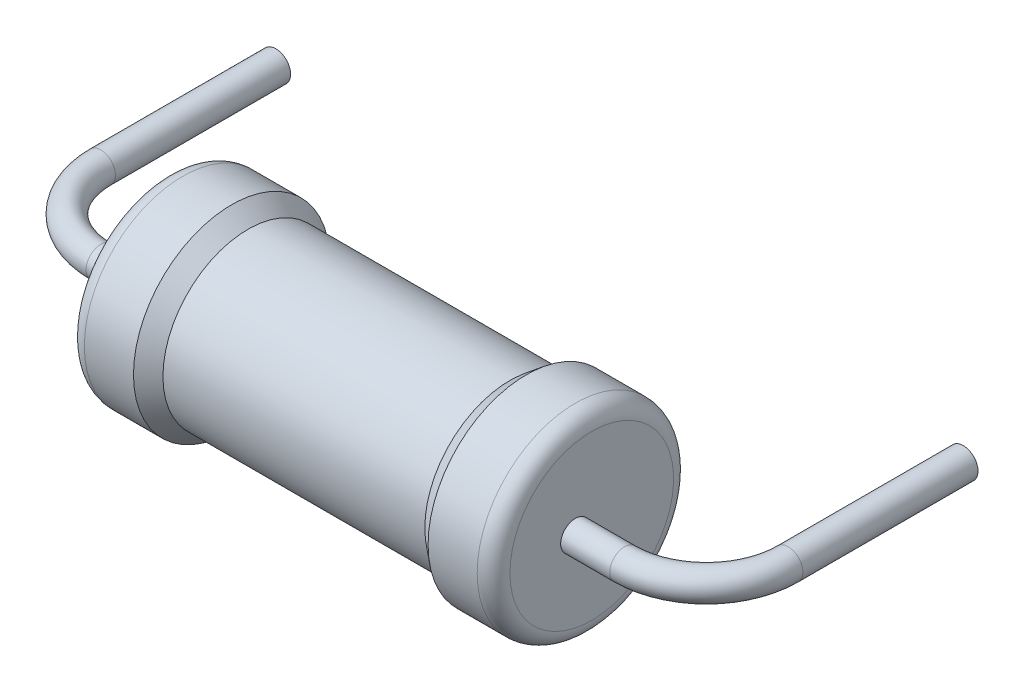
ISO-10303-21;
HEADER;
FILE_DESCRIPTION(('STEP AP214'),'2;1');
FILE_NAME('part.step','',(''),(''),'','','');
FILE_SCHEMA(('AUTOMOTIVE_DESIGN { 1 0 10303 214 1 1 1 1 }'));
ENDSEC;
DATA;
#1=APPLICATION_CONTEXT('core data for automotive mechanical design processes');
#2=APPLICATION_PROTOCOL_DEFINITION('international standard','automotive_design',2000,#1);
#3=PRODUCT_CONTEXT('',#1,'mechanical');
#4=PRODUCT('Part','Part','',(#3));
#5=PRODUCT_RELATED_PRODUCT_CATEGORY('part','',(#4));
#6=PRODUCT_DEFINITION_FORMATION('','',#4);
#7=PRODUCT_DEFINITION_CONTEXT('part definition',#1,'design');
#8=PRODUCT_DEFINITION('design','',#6,#7);
#9=PRODUCT_DEFINITION_SHAPE('','',#8);
#10=(LENGTH_UNIT() NAMED_UNIT(*) SI_UNIT(.MILLI.,.METRE.));
#11=(NAMED_UNIT(*) PLANE_ANGLE_UNIT() SI_UNIT($,.RADIAN.));
#12=(NAMED_UNIT(*) SI_UNIT($,.STERADIAN.) SOLID_ANGLE_UNIT());
#13=UNCERTAINTY_MEASURE_WITH_UNIT(LENGTH_MEASURE(1.E-05),#10,'distance_accuracy_value','');
#14=(GEOMETRIC_REPRESENTATION_CONTEXT(3) GLOBAL_UNCERTAINTY_ASSIGNED_CONTEXT((#13)) GLOBAL_UNIT_ASSIGNED_CONTEXT((#10,
#11,#12)) REPRESENTATION_CONTEXT('',''));
#15=CARTESIAN_POINT('',(0.,0.,0.));
#16=DIRECTION('',(0.,0.,1.));
#17=DIRECTION('',(1.,0.,0.));
#18=AXIS2_PLACEMENT_3D('',#15,#16,#17);
#19=CARTESIAN_POINT('',(17.,0.,3.35));
#20=DIRECTION('',(-1.,0.,0.));
#21=DIRECTION('',(0.,0.,1.));
#22=AXIS2_PLACEMENT_3D('',#19,#20,#21);
#23=PLANE('',#22);
#24=CARTESIAN_POINT('',(17.,0.,3.35));
#25=DIRECTION('',(-1.,0.,0.));
#26=DIRECTION('',(0.,0.,1.));
#27=AXIS2_PLACEMENT_3D('',#24,#25,#26);
#28=CIRCLE('',#27,2.5);
#29=CARTESIAN_POINT('',(17.,0.,5.85));
#30=VERTEX_POINT('',#29);
#31=EDGE_CURVE('E42',#30,#30,#28,.F.);
#32=ORIENTED_EDGE('',*,*,#31,.T.);
#33=EDGE_LOOP('',(#32));
#34=FACE_BOUND('',#33,.T.);
#35=CARTESIAN_POINT('',(17.,0.,3.85));
#36=DIRECTION('',(-1.,0.,0.));
#37=DIRECTION('',(0.,0.,1.));
#38=AXIS2_PLACEMENT_3D('',#35,#36,#37);
#39=CIRCLE('',#38,0.450000000000001);
#40=CARTESIAN_POINT('',(17.,0.,4.3));
#41=VERTEX_POINT('',#40);
#42=EDGE_CURVE('E55',#41,#41,#39,.T.);
#43=ORIENTED_EDGE('',*,*,#42,.T.);
#44=EDGE_LOOP('',(#43));
#45=FACE_BOUND('',#44,.T.);
#46=ADVANCED_FACE('F31',(#34,#45),#23,.F.);
#47=CARTESIAN_POINT('',(4.,0.,3.35));
#48=DIRECTION('',(1.,0.,0.));
#49=DIRECTION('',(0.,0.,-1.));
#50=AXIS2_PLACEMENT_3D('',#47,#48,#49);
#51=PLANE('',#50);
#52=CARTESIAN_POINT('',(4.,0.,3.35));
#53=DIRECTION('',(1.,0.,0.));
#54=DIRECTION('',(0.,0.,-1.));
#55=AXIS2_PLACEMENT_3D('',#52,#53,#54);
#56=CIRCLE('',#55,2.5);
#57=CARTESIAN_POINT('',(4.,0.,0.85));
#58=VERTEX_POINT('',#57);
#59=EDGE_CURVE('E38',#58,#58,#56,.F.);
#60=ORIENTED_EDGE('',*,*,#59,.T.);
#61=EDGE_LOOP('',(#60));
#62=FACE_BOUND('',#61,.T.);
#63=CARTESIAN_POINT('',(4.,0.,3.85));
#64=DIRECTION('',(1.,0.,0.));
#65=DIRECTION('',(0.,0.,-1.));
#66=AXIS2_PLACEMENT_3D('',#63,#64,#65);
#67=CIRCLE('',#66,0.450000000000001);
#68=CARTESIAN_POINT('',(4.,0.,3.4));
#69=VERTEX_POINT('',#68);
#70=EDGE_CURVE('E52',#69,#69,#67,.T.);
#71=ORIENTED_EDGE('',*,*,#70,.T.);
#72=EDGE_LOOP('',(#71));
#73=FACE_BOUND('',#72,.T.);
#74=ADVANCED_FACE('F108',(#62,#73),#51,.F.);
#75=CARTESIAN_POINT('',(0.,0.,3.35));
#76=DIRECTION('',(-1.,0.,0.));
#77=DIRECTION('',(0.,0.,1.));
#78=AXIS2_PLACEMENT_3D('',#75,#76,#77);
#79=CYLINDRICAL_SURFACE('',#78,3.);
#80=CARTESIAN_POINT('',(4.5,0.,3.35));
#81=DIRECTION('',(1.,0.,0.));
#82=DIRECTION('',(0.,0.,-1.));
#83=AXIS2_PLACEMENT_3D('',#80,#81,#82);
#84=CIRCLE('',#83,3.);
#85=CARTESIAN_POINT('',(4.5,0.,0.35));
#86=VERTEX_POINT('',#85);
#87=EDGE_CURVE('E10',#86,#86,#84,.T.);
#88=ORIENTED_EDGE('',*,*,#87,.T.);
#89=EDGE_LOOP('',(#88));
#90=FACE_BOUND('',#89,.T.);
#91=CARTESIAN_POINT('',(6.,0.,3.35));
#92=DIRECTION('',(-1.,0.,0.));
#93=DIRECTION('',(0.,0.,1.));
#94=AXIS2_PLACEMENT_3D('',#91,#92,#93);
#95=CIRCLE('',#94,3.);
#96=CARTESIAN_POINT('',(6.,0.,6.35));
#97=VERTEX_POINT('',#96);
#98=EDGE_CURVE('E51',#97,#97,#95,.T.);
#99=ORIENTED_EDGE('',*,*,#98,.T.);
#100=EDGE_LOOP('',(#99));
#101=FACE_BOUND('',#100,.T.);
#102=ADVANCED_FACE('F114',(#90,#101),#79,.T.);
#103=CARTESIAN_POINT('',(6.5,0.,3.35));
#104=DIRECTION('',(-1.,0.,0.));
#105=DIRECTION('',(0.,0.,1.));
#106=AXIS2_PLACEMENT_3D('',#103,#104,#105);
#107=CONICAL_SURFACE('',#106,2.6,0.674740942223552);
#108=ORIENTED_EDGE('',*,*,#98,.F.);
#109=EDGE_LOOP('',(#108));
#110=FACE_BOUND('',#109,.T.);
#111=CARTESIAN_POINT('',(6.5,0.,3.35));
#112=DIRECTION('',(-1.,0.,0.));
#113=DIRECTION('',(0.,0.,1.));
#114=AXIS2_PLACEMENT_3D('',#111,#112,#113);
#115=CIRCLE('',#114,2.6);
#116=CARTESIAN_POINT('',(6.5,0.,5.95));
#117=VERTEX_POINT('',#116);
#118=EDGE_CURVE('E59',#117,#117,#115,.T.);
#119=ORIENTED_EDGE('',*,*,#118,.T.);
#120=EDGE_LOOP('',(#119));
#121=FACE_BOUND('',#120,.T.);
#122=ADVANCED_FACE('F143',(#110,#121),#107,.T.);
#123=CARTESIAN_POINT('',(0.,0.,3.35));
#124=DIRECTION('',(-1.,0.,0.));
#125=DIRECTION('',(0.,0.,1.));
#126=AXIS2_PLACEMENT_3D('',#123,#124,#125);
#127=CYLINDRICAL_SURFACE('',#126,2.6);
#128=ORIENTED_EDGE('',*,*,#118,.F.);
#129=EDGE_LOOP('',(#128));
#130=FACE_BOUND('',#129,.T.);
#131=CARTESIAN_POINT('',(14.5,0.,3.35));
#132=DIRECTION('',(-1.,0.,0.));
#133=DIRECTION('',(0.,0.,1.));
#134=AXIS2_PLACEMENT_3D('',#131,#132,#133);
#135=CIRCLE('',#134,2.6);
#136=CARTESIAN_POINT('',(14.5,0.,5.95));
#137=VERTEX_POINT('',#136);
#138=EDGE_CURVE('E62',#137,#137,#135,.T.);
#139=ORIENTED_EDGE('',*,*,#138,.T.);
#140=EDGE_LOOP('',(#139));
#141=FACE_BOUND('',#140,.T.);
#142=ADVANCED_FACE('F137',(#130,#141),#127,.T.);
#143=CARTESIAN_POINT('',(15.,0.,3.35));
#144=DIRECTION('',(1.,0.,0.));
#145=DIRECTION('',(0.,0.,-1.));
#146=AXIS2_PLACEMENT_3D('',#143,#144,#145);
#147=CONICAL_SURFACE('',#146,3.,0.674740942223552);
#148=ORIENTED_EDGE('',*,*,#138,.F.);
#149=EDGE_LOOP('',(#148));
#150=FACE_BOUND('',#149,.T.);
#151=CARTESIAN_POINT('',(15.,0.,3.35));
#152=DIRECTION('',(-1.,0.,0.));
#153=DIRECTION('',(0.,0.,1.));
#154=AXIS2_PLACEMENT_3D('',#151,#152,#153);
#155=CIRCLE('',#154,3.);
#156=CARTESIAN_POINT('',(15.,0.,6.35));
#157=VERTEX_POINT('',#156);
#158=EDGE_CURVE('E65',#157,#157,#155,.T.);
#159=ORIENTED_EDGE('',*,*,#158,.T.);
#160=EDGE_LOOP('',(#159));
#161=FACE_BOUND('',#160,.T.);
#162=ADVANCED_FACE('F133',(#150,#161),#147,.T.);
#163=CARTESIAN_POINT('',(0.,0.,3.35));
#164=DIRECTION('',(-1.,0.,0.));
#165=DIRECTION('',(0.,0.,1.));
#166=AXIS2_PLACEMENT_3D('',#163,#164,#165);
#167=CYLINDRICAL_SURFACE('',#166,3.);
#168=CARTESIAN_POINT('',(16.5,0.,3.35));
#169=DIRECTION('',(-1.,0.,0.));
#170=DIRECTION('',(0.,0.,1.));
#171=AXIS2_PLACEMENT_3D('',#168,#169,#170);
#172=CIRCLE('',#171,3.);
#173=CARTESIAN_POINT('',(16.5,0.,6.35));
#174=VERTEX_POINT('',#173);
#175=EDGE_CURVE('E46',#174,#174,#172,.T.);
#176=ORIENTED_EDGE('',*,*,#175,.T.);
#177=EDGE_LOOP('',(#176));
#178=FACE_BOUND('',#177,.T.);
#179=ORIENTED_EDGE('',*,*,#158,.F.);
#180=EDGE_LOOP('',(#179));
#181=FACE_BOUND('',#180,.T.);
#182=ADVANCED_FACE('F129',(#178,#181),#167,.T.);
#183=CARTESIAN_POINT('',(0.,0.,1.34999999999999));
#184=DIRECTION('',(0.,0.,-1.));
#185=DIRECTION('',(-1.,0.,0.));
#186=AXIS2_PLACEMENT_3D('',#183,#184,#185);
#187=CYLINDRICAL_SURFACE('',#186,0.450000000000001);
#188=CARTESIAN_POINT('',(0.,0.,1.34999999999999));
#189=DIRECTION('',(0.,0.,1.));
#190=DIRECTION('',(1.,0.,0.));
#191=AXIS2_PLACEMENT_3D('',#188,#189,#190);
#192=CIRCLE('',#191,0.450000000000001);
#193=CARTESIAN_POINT('',(-0.450000000000001,0.,1.34999999999998));
#194=VERTEX_POINT('',#193);
#195=EDGE_CURVE('E78',#194,#194,#192,.T.);
#196=ORIENTED_EDGE('',*,*,#195,.F.);
#197=EDGE_LOOP('',(#196));
#198=FACE_BOUND('',#197,.T.);
#199=CARTESIAN_POINT('',(0.,0.,-4.));
#200=DIRECTION('',(0.,0.,-1.));
#201=DIRECTION('',(-1.,0.,0.));
#202=AXIS2_PLACEMENT_3D('',#199,#200,#201);
#203=CIRCLE('',#202,0.450000000000001);
#204=CARTESIAN_POINT('',(-0.450000000000001,0.,-4.));
#205=VERTEX_POINT('',#204);
#206=EDGE_CURVE('E81',#205,#205,#203,.T.);
#207=ORIENTED_EDGE('',*,*,#206,.F.);
#208=EDGE_LOOP('',(#207));
#209=FACE_BOUND('',#208,.T.);
#210=ADVANCED_FACE('F132',(#198,#209),#187,.T.);
#211=CARTESIAN_POINT('',(2.5,0.,1.35));
#212=DIRECTION('',(0.,1.,0.));
#213=DIRECTION('',(0.,0.,1.));
#214=AXIS2_PLACEMENT_3D('',#211,#212,#213);
#215=TOROIDAL_SURFACE('',#214,2.5,0.450000000000001);
#216=CARTESIAN_POINT('',(2.5,0.,3.85));
#217=DIRECTION('',(1.,0.,0.));
#218=DIRECTION('',(0.,0.,-1.));
#219=AXIS2_PLACEMENT_3D('',#216,#217,#218);
#220=CIRCLE('',#219,0.450000000000001);
#221=CARTESIAN_POINT('',(2.50000000000001,0.,4.3));
#222=VERTEX_POINT('',#221);
#223=EDGE_CURVE('E75',#222,#222,#220,.T.);
#224=CARTESIAN_POINT('',(2.5,0.,1.35));
#225=DIRECTION('',(0.,1.,0.));
#226=DIRECTION('',(0.,0.,1.));
#227=AXIS2_PLACEMENT_3D('',#224,#225,#226);
#228=CIRCLE('',#227,2.95);
#229=EDGE_CURVE('',#194,#222,#228,.T.);
#230=ORIENTED_EDGE('',*,*,#195,.T.);
#231=ORIENTED_EDGE('',*,*,#223,.F.);
#232=ORIENTED_EDGE('',*,*,#229,.T.);
#233=ORIENTED_EDGE('',*,*,#229,.F.);
#234=EDGE_LOOP('',(#230,#232,#231,#233));
#235=FACE_BOUND('',#234,.T.);
#236=ADVANCED_FACE('F179',(#235),#215,.T.);
#237=CARTESIAN_POINT('',(2.5,0.,3.85));
#238=DIRECTION('',(1.,0.,0.));
#239=DIRECTION('',(0.,0.,-1.));
#240=AXIS2_PLACEMENT_3D('',#237,#238,#239);
#241=CYLINDRICAL_SURFACE('',#240,0.450000000000001);
#242=ORIENTED_EDGE('',*,*,#223,.T.);
#243=EDGE_LOOP('',(#242));
#244=FACE_BOUND('',#243,.T.);
#245=ORIENTED_EDGE('',*,*,#70,.F.);
#246=EDGE_LOOP('',(#245));
#247=FACE_BOUND('',#246,.T.);
#248=ADVANCED_FACE('F103',(#244,#247),#241,.T.);
#249=CARTESIAN_POINT('',(18.5,0.,3.85));
#250=DIRECTION('',(1.,0.,0.));
#251=DIRECTION('',(0.,0.,-1.));
#252=AXIS2_PLACEMENT_3D('',#249,#250,#251);
#253=CIRCLE('',#252,0.450000000000001);
#254=CARTESIAN_POINT('',(18.5,0.,4.3));
#255=VERTEX_POINT('',#254);
#256=EDGE_CURVE('E72',#255,#255,#253,.T.);
#257=ORIENTED_EDGE('',*,*,#256,.F.);
#258=EDGE_LOOP('',(#257));
#259=FACE_BOUND('',#258,.T.);
#260=ORIENTED_EDGE('',*,*,#42,.F.);
#261=EDGE_LOOP('',(#260));
#262=FACE_BOUND('',#261,.T.);
#263=ADVANCED_FACE('F93',(#259,#262),#241,.T.);
#264=CARTESIAN_POINT('',(21.,0.,1.34999999999998));
#265=DIRECTION('',(0.,0.,-1.));
#266=DIRECTION('',(-1.,0.,0.));
#267=AXIS2_PLACEMENT_3D('',#264,#265,#266);
#268=CYLINDRICAL_SURFACE('',#267,0.450000000000001);
#269=CARTESIAN_POINT('',(21.,0.,1.34999999999998));
#270=DIRECTION('',(0.,0.,-1.));
#271=DIRECTION('',(-1.,0.,0.));
#272=AXIS2_PLACEMENT_3D('',#269,#270,#271);
#273=CIRCLE('',#272,0.450000000000001);
#274=CARTESIAN_POINT('',(21.45,0.,1.34999999999997));
#275=VERTEX_POINT('',#274);
#276=EDGE_CURVE('E56',#275,#275,#273,.T.);
#277=ORIENTED_EDGE('',*,*,#276,.T.);
#278=EDGE_LOOP('',(#277));
#279=FACE_BOUND('',#278,.T.);
#280=CARTESIAN_POINT('',(21.,0.,-4.));
#281=DIRECTION('',(0.,0.,-1.));
#282=DIRECTION('',(-1.,0.,0.));
#283=AXIS2_PLACEMENT_3D('',#280,#281,#282);
#284=CIRCLE('',#283,0.450000000000002);
#285=CARTESIAN_POINT('',(20.55,0.,-4.));
#286=VERTEX_POINT('',#285);
#287=EDGE_CURVE('E84',#286,#286,#284,.T.);
#288=ORIENTED_EDGE('',*,*,#287,.F.);
#289=EDGE_LOOP('',(#288));
#290=FACE_BOUND('',#289,.T.);
#291=ADVANCED_FACE('F90',(#279,#290),#268,.T.);
#292=CARTESIAN_POINT('',(18.5,0.,1.35));
#293=DIRECTION('',(0.,1.,0.));
#294=DIRECTION('',(0.,0.,1.));
#295=AXIS2_PLACEMENT_3D('',#292,#293,#294);
#296=TOROIDAL_SURFACE('',#295,2.5,0.450000000000001);
#297=CARTESIAN_POINT('',(18.5,0.,1.35));
#298=DIRECTION('',(0.,1.,0.));
#299=DIRECTION('',(0.,0.,1.));
#300=AXIS2_PLACEMENT_3D('',#297,#298,#299);
#301=CIRCLE('',#300,2.95);
#302=EDGE_CURVE('',#255,#275,#301,.T.);
#303=ORIENTED_EDGE('',*,*,#256,.T.);
#304=ORIENTED_EDGE('',*,*,#276,.F.);
#305=ORIENTED_EDGE('',*,*,#302,.T.);
#306=ORIENTED_EDGE('',*,*,#302,.F.);
#307=EDGE_LOOP('',(#303,#305,#304,#306));
#308=FACE_BOUND('',#307,.T.);
#309=ADVANCED_FACE('F92',(#308),#296,.T.);
#310=CARTESIAN_POINT('',(16.5,0.,3.35));
#311=DIRECTION('',(-1.,0.,0.));
#312=DIRECTION('',(0.,0.,1.));
#313=AXIS2_PLACEMENT_3D('',#310,#311,#312);
#314=TOROIDAL_SURFACE('',#313,2.5,0.5);
#315=ORIENTED_EDGE('',*,*,#31,.F.);
#316=EDGE_LOOP('',(#315));
#317=FACE_BOUND('',#316,.T.);
#318=ORIENTED_EDGE('',*,*,#175,.F.);
#319=EDGE_LOOP('',(#318));
#320=FACE_BOUND('',#319,.T.);
#321=ADVANCED_FACE('F100',(#317,#320),#314,.T.);
#322=CARTESIAN_POINT('',(4.5,0.,3.35));
#323=DIRECTION('',(1.,0.,0.));
#324=DIRECTION('',(0.,0.,-1.));
#325=AXIS2_PLACEMENT_3D('',#322,#323,#324);
#326=TOROIDAL_SURFACE('',#325,2.5,0.5);
#327=ORIENTED_EDGE('',*,*,#87,.F.);
#328=EDGE_LOOP('',(#327));
#329=FACE_BOUND('',#328,.T.);
#330=ORIENTED_EDGE('',*,*,#59,.F.);
#331=EDGE_LOOP('',(#330));
#332=FACE_BOUND('',#331,.T.);
#333=ADVANCED_FACE('F33',(#329,#332),#326,.T.);
#334=CARTESIAN_POINT('',(0.,0.,-4.));
#335=DIRECTION('',(0.,0.,-1.));
#336=DIRECTION('',(-1.,0.,0.));
#337=AXIS2_PLACEMENT_3D('',#334,#335,#336);
#338=PLANE('',#337);
#339=ORIENTED_EDGE('',*,*,#206,.T.);
#340=EDGE_LOOP('',(#339));
#341=FACE_BOUND('',#340,.T.);
#342=ADVANCED_FACE('F123',(#341),#338,.T.);
#343=CARTESIAN_POINT('',(21.,0.,-4.));
#344=DIRECTION('',(0.,0.,-1.));
#345=DIRECTION('',(-1.,0.,0.));
#346=AXIS2_PLACEMENT_3D('',#343,#344,#345);
#347=PLANE('',#346);
#348=ORIENTED_EDGE('',*,*,#287,.T.);
#349=EDGE_LOOP('',(#348));
#350=FACE_BOUND('',#349,.T.);
#351=ADVANCED_FACE('F88',(#350),#347,.T.);
#352=CLOSED_SHELL('',(#46,#74,#102,#122,#142,#162,#182,#210,#236,#248,#263,#291,#309,#321,#333,
#342,#351));
#353=MANIFOLD_SOLID_BREP('B2',#352);
#354=ADVANCED_BREP_SHAPE_REPRESENTATION('',(#18,#353),#14);
#355=SHAPE_DEFINITION_REPRESENTATION(#9,#354);
ENDSEC;
END-ISO-10303-21;
